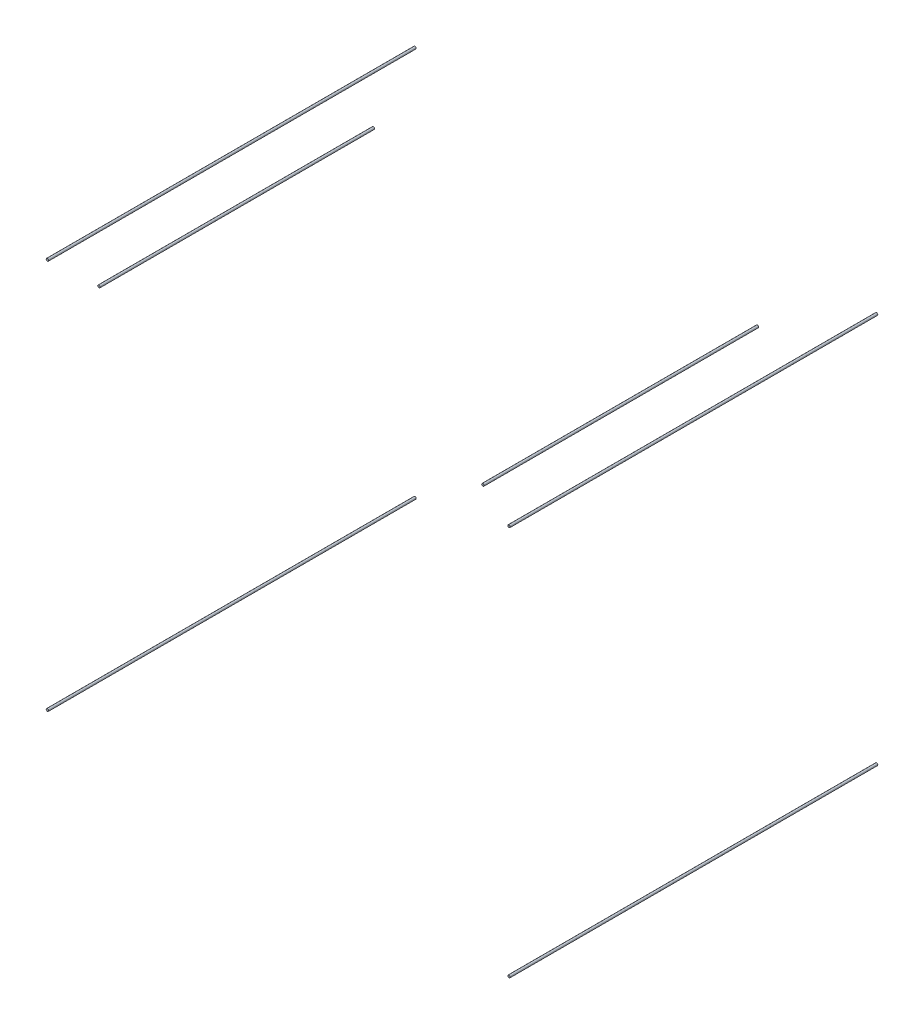
ISO-10303-21;
HEADER;
FILE_DESCRIPTION(('STEP AP214'),'2;1');
FILE_NAME('part.step','',(''),(''),'','','');
FILE_SCHEMA(('AUTOMOTIVE_DESIGN { 1 0 10303 214 1 1 1 1 }'));
ENDSEC;
DATA;
#1=APPLICATION_CONTEXT('core data for automotive mechanical design processes');
#2=APPLICATION_PROTOCOL_DEFINITION('international standard','automotive_design',2000,#1);
#3=PRODUCT_CONTEXT('',#1,'mechanical');
#4=PRODUCT('Part','Part','',(#3));
#5=PRODUCT_RELATED_PRODUCT_CATEGORY('part','',(#4));
#6=PRODUCT_DEFINITION_FORMATION('','',#4);
#7=PRODUCT_DEFINITION_CONTEXT('part definition',#1,'design');
#8=PRODUCT_DEFINITION('design','',#6,#7);
#9=PRODUCT_DEFINITION_SHAPE('','',#8);
#10=(LENGTH_UNIT() NAMED_UNIT(*) SI_UNIT(.MILLI.,.METRE.));
#11=(NAMED_UNIT(*) PLANE_ANGLE_UNIT() SI_UNIT($,.RADIAN.));
#12=(NAMED_UNIT(*) SI_UNIT($,.STERADIAN.) SOLID_ANGLE_UNIT());
#13=UNCERTAINTY_MEASURE_WITH_UNIT(LENGTH_MEASURE(1.E-05),#10,'distance_accuracy_value','');
#14=(GEOMETRIC_REPRESENTATION_CONTEXT(3) GLOBAL_UNCERTAINTY_ASSIGNED_CONTEXT((#13)) GLOBAL_UNIT_ASSIGNED_CONTEXT((#10,
#11,#12)) REPRESENTATION_CONTEXT('',''));
#15=CARTESIAN_POINT('',(0.,0.,0.));
#16=DIRECTION('',(0.,0.,1.));
#17=DIRECTION('',(1.,0.,0.));
#18=AXIS2_PLACEMENT_3D('',#15,#16,#17);
#19=CARTESIAN_POINT('',(56.63,53.77,44.6));
#20=DIRECTION('',(0.,0.,-1.));
#21=DIRECTION('',(-1.,0.,0.));
#22=AXIS2_PLACEMENT_3D('',#19,#20,#21);
#23=CYLINDRICAL_SURFACE('',#22,0.149999999999997);
#24=CARTESIAN_POINT('',(56.63,53.77,44.6));
#25=DIRECTION('',(0.,0.,1.));
#26=DIRECTION('',(1.,0.,0.));
#27=AXIS2_PLACEMENT_3D('',#24,#25,#26);
#28=CIRCLE('',#27,0.149999999999997);
#29=CARTESIAN_POINT('',(56.78,53.77,44.6));
#30=VERTEX_POINT('',#29);
#31=EDGE_CURVE('E50',#30,#30,#28,.T.);
#32=ORIENTED_EDGE('',*,*,#31,.F.);
#33=EDGE_LOOP('',(#32));
#34=FACE_BOUND('',#33,.T.);
#35=CARTESIAN_POINT('',(56.63,53.77,10.1));
#36=DIRECTION('',(0.,0.,1.));
#37=DIRECTION('',(1.,0.,0.));
#38=AXIS2_PLACEMENT_3D('',#35,#36,#37);
#39=CIRCLE('',#38,0.149999999999997);
#40=CARTESIAN_POINT('',(56.78,53.77,10.1));
#41=VERTEX_POINT('',#40);
#42=EDGE_CURVE('E11',#41,#41,#39,.T.);
#43=ORIENTED_EDGE('',*,*,#42,.T.);
#44=EDGE_LOOP('',(#43));
#45=FACE_BOUND('',#44,.T.);
#46=ADVANCED_FACE('F46',(#34,#45),#23,.T.);
#47=CARTESIAN_POINT('',(56.63,53.77,44.6));
#48=DIRECTION('',(0.,0.,1.));
#49=DIRECTION('',(1.,0.,0.));
#50=AXIS2_PLACEMENT_3D('',#47,#48,#49);
#51=PLANE('',#50);
#52=ORIENTED_EDGE('',*,*,#31,.T.);
#53=EDGE_LOOP('',(#52));
#54=FACE_BOUND('',#53,.T.);
#55=ADVANCED_FACE('F48',(#54),#51,.T.);
#56=CARTESIAN_POINT('',(56.63,53.77,10.1));
#57=DIRECTION('',(0.,0.,1.));
#58=DIRECTION('',(1.,0.,0.));
#59=AXIS2_PLACEMENT_3D('',#56,#57,#58);
#60=PLANE('',#59);
#61=ORIENTED_EDGE('',*,*,#42,.F.);
#62=EDGE_LOOP('',(#61));
#63=FACE_BOUND('',#62,.T.);
#64=ADVANCED_FACE('F65',(#63),#60,.F.);
#65=CLOSED_SHELL('',(#46,#55,#64));
#66=MANIFOLD_SOLID_BREP('B2',#65);
#67=CARTESIAN_POINT('',(8.37,51.23,44.6));
#68=DIRECTION('',(0.,0.,-1.));
#69=DIRECTION('',(-1.,0.,0.));
#70=AXIS2_PLACEMENT_3D('',#67,#68,#69);
#71=CYLINDRICAL_SURFACE('',#70,0.150000000000001);
#72=CARTESIAN_POINT('',(8.37,51.23,44.6));
#73=DIRECTION('',(0.,0.,1.));
#74=DIRECTION('',(1.,0.,0.));
#75=AXIS2_PLACEMENT_3D('',#72,#73,#74);
#76=CIRCLE('',#75,0.150000000000001);
#77=CARTESIAN_POINT('',(8.52,51.23,44.6));
#78=VERTEX_POINT('',#77);
#79=EDGE_CURVE('E45',#78,#78,#76,.T.);
#80=ORIENTED_EDGE('',*,*,#79,.F.);
#81=EDGE_LOOP('',(#80));
#82=FACE_BOUND('',#81,.T.);
#83=CARTESIAN_POINT('',(8.37,51.23,10.1));
#84=DIRECTION('',(0.,0.,1.));
#85=DIRECTION('',(1.,0.,0.));
#86=AXIS2_PLACEMENT_3D('',#83,#84,#85);
#87=CIRCLE('',#86,0.150000000000001);
#88=CARTESIAN_POINT('',(8.52,51.23,10.1));
#89=VERTEX_POINT('',#88);
#90=EDGE_CURVE('E98',#89,#89,#87,.T.);
#91=ORIENTED_EDGE('',*,*,#90,.T.);
#92=EDGE_LOOP('',(#91));
#93=FACE_BOUND('',#92,.T.);
#94=ADVANCED_FACE('F95',(#82,#93),#71,.T.);
#95=CARTESIAN_POINT('',(8.37,51.23,44.6));
#96=DIRECTION('',(0.,0.,1.));
#97=DIRECTION('',(1.,0.,0.));
#98=AXIS2_PLACEMENT_3D('',#95,#96,#97);
#99=PLANE('',#98);
#100=ORIENTED_EDGE('',*,*,#79,.T.);
#101=EDGE_LOOP('',(#100));
#102=FACE_BOUND('',#101,.T.);
#103=ADVANCED_FACE('F110',(#102),#99,.T.);
#104=CARTESIAN_POINT('',(8.37,51.23,10.1));
#105=DIRECTION('',(0.,0.,1.));
#106=DIRECTION('',(1.,0.,0.));
#107=AXIS2_PLACEMENT_3D('',#104,#105,#106);
#108=PLANE('',#107);
#109=ORIENTED_EDGE('',*,*,#90,.F.);
#110=EDGE_LOOP('',(#109));
#111=FACE_BOUND('',#110,.T.);
#112=ADVANCED_FACE('F108',(#111),#108,.F.);
#113=CLOSED_SHELL('',(#94,#103,#112));
#114=MANIFOLD_SOLID_BREP('B6',#113);
#115=CARTESIAN_POINT('',(61.5,52.5,46.2));
#116=DIRECTION('',(0.,0.,-1.));
#117=DIRECTION('',(-1.,0.,0.));
#118=AXIS2_PLACEMENT_3D('',#115,#116,#117);
#119=CYLINDRICAL_SURFACE('',#118,0.149999999999997);
#120=CARTESIAN_POINT('',(61.5,52.5,46.2));
#121=DIRECTION('',(0.,0.,1.));
#122=DIRECTION('',(1.,0.,0.));
#123=AXIS2_PLACEMENT_3D('',#120,#121,#122);
#124=CIRCLE('',#123,0.149999999999997);
#125=CARTESIAN_POINT('',(61.65,52.5,46.2));
#126=VERTEX_POINT('',#125);
#127=EDGE_CURVE('E148',#126,#126,#124,.T.);
#128=ORIENTED_EDGE('',*,*,#127,.F.);
#129=EDGE_LOOP('',(#128));
#130=FACE_BOUND('',#129,.T.);
#131=CARTESIAN_POINT('',(61.5,52.5,0.));
#132=DIRECTION('',(0.,0.,1.));
#133=DIRECTION('',(1.,0.,0.));
#134=AXIS2_PLACEMENT_3D('',#131,#132,#133);
#135=CIRCLE('',#134,0.149999999999997);
#136=CARTESIAN_POINT('',(61.65,52.5,0.));
#137=VERTEX_POINT('',#136);
#138=EDGE_CURVE('E94',#137,#137,#135,.T.);
#139=ORIENTED_EDGE('',*,*,#138,.T.);
#140=EDGE_LOOP('',(#139));
#141=FACE_BOUND('',#140,.T.);
#142=ADVANCED_FACE('F144',(#130,#141),#119,.T.);
#143=CARTESIAN_POINT('',(61.5,52.5,46.2));
#144=DIRECTION('',(0.,0.,1.));
#145=DIRECTION('',(1.,0.,0.));
#146=AXIS2_PLACEMENT_3D('',#143,#144,#145);
#147=PLANE('',#146);
#148=ORIENTED_EDGE('',*,*,#127,.T.);
#149=EDGE_LOOP('',(#148));
#150=FACE_BOUND('',#149,.T.);
#151=ADVANCED_FACE('F146',(#150),#147,.T.);
#152=CARTESIAN_POINT('',(61.5,52.5,0.));
#153=DIRECTION('',(0.,0.,1.));
#154=DIRECTION('',(1.,0.,0.));
#155=AXIS2_PLACEMENT_3D('',#152,#153,#154);
#156=PLANE('',#155);
#157=ORIENTED_EDGE('',*,*,#138,.F.);
#158=EDGE_LOOP('',(#157));
#159=FACE_BOUND('',#158,.T.);
#160=ADVANCED_FACE('F163',(#159),#156,.F.);
#161=CLOSED_SHELL('',(#142,#151,#160));
#162=MANIFOLD_SOLID_BREP('B40',#161);
#163=CARTESIAN_POINT('',(3.5,52.5,46.2));
#164=DIRECTION('',(0.,0.,-1.));
#165=DIRECTION('',(-1.,0.,0.));
#166=AXIS2_PLACEMENT_3D('',#163,#164,#165);
#167=CYLINDRICAL_SURFACE('',#166,0.15);
#168=CARTESIAN_POINT('',(3.5,52.5,46.2));
#169=DIRECTION('',(0.,0.,1.));
#170=DIRECTION('',(1.,0.,0.));
#171=AXIS2_PLACEMENT_3D('',#168,#169,#170);
#172=CIRCLE('',#171,0.15);
#173=CARTESIAN_POINT('',(3.65,52.5,46.2));
#174=VERTEX_POINT('',#173);
#175=EDGE_CURVE('E197',#174,#174,#172,.T.);
#176=ORIENTED_EDGE('',*,*,#175,.F.);
#177=EDGE_LOOP('',(#176));
#178=FACE_BOUND('',#177,.T.);
#179=CARTESIAN_POINT('',(3.5,52.5,0.));
#180=DIRECTION('',(0.,0.,1.));
#181=DIRECTION('',(1.,0.,0.));
#182=AXIS2_PLACEMENT_3D('',#179,#180,#181);
#183=CIRCLE('',#182,0.15);
#184=CARTESIAN_POINT('',(3.65,52.5,0.));
#185=VERTEX_POINT('',#184);
#186=EDGE_CURVE('E143',#185,#185,#183,.T.);
#187=ORIENTED_EDGE('',*,*,#186,.T.);
#188=EDGE_LOOP('',(#187));
#189=FACE_BOUND('',#188,.T.);
#190=ADVANCED_FACE('F193',(#178,#189),#167,.T.);
#191=CARTESIAN_POINT('',(3.5,52.5,46.2));
#192=DIRECTION('',(0.,0.,1.));
#193=DIRECTION('',(1.,0.,0.));
#194=AXIS2_PLACEMENT_3D('',#191,#192,#193);
#195=PLANE('',#194);
#196=ORIENTED_EDGE('',*,*,#175,.T.);
#197=EDGE_LOOP('',(#196));
#198=FACE_BOUND('',#197,.T.);
#199=ADVANCED_FACE('F195',(#198),#195,.T.);
#200=CARTESIAN_POINT('',(3.5,52.5,0.));
#201=DIRECTION('',(0.,0.,1.));
#202=DIRECTION('',(1.,0.,0.));
#203=AXIS2_PLACEMENT_3D('',#200,#201,#202);
#204=PLANE('',#203);
#205=ORIENTED_EDGE('',*,*,#186,.F.);
#206=EDGE_LOOP('',(#205));
#207=FACE_BOUND('',#206,.T.);
#208=ADVANCED_FACE('F212',(#207),#204,.F.);
#209=CLOSED_SHELL('',(#190,#199,#208));
#210=MANIFOLD_SOLID_BREP('B89',#209);
#211=CARTESIAN_POINT('',(61.5,3.5,46.2));
#212=DIRECTION('',(0.,0.,-1.));
#213=DIRECTION('',(-1.,0.,0.));
#214=AXIS2_PLACEMENT_3D('',#211,#212,#213);
#215=CYLINDRICAL_SURFACE('',#214,0.149999999999997);
#216=CARTESIAN_POINT('',(61.5,3.5,46.2));
#217=DIRECTION('',(0.,0.,1.));
#218=DIRECTION('',(1.,0.,0.));
#219=AXIS2_PLACEMENT_3D('',#216,#217,#218);
#220=CIRCLE('',#219,0.149999999999997);
#221=CARTESIAN_POINT('',(61.65,3.5,46.2));
#222=VERTEX_POINT('',#221);
#223=EDGE_CURVE('E245',#222,#222,#220,.T.);
#224=ORIENTED_EDGE('',*,*,#223,.F.);
#225=EDGE_LOOP('',(#224));
#226=FACE_BOUND('',#225,.T.);
#227=CARTESIAN_POINT('',(61.5,3.5,0.));
#228=DIRECTION('',(0.,0.,1.));
#229=DIRECTION('',(1.,0.,0.));
#230=AXIS2_PLACEMENT_3D('',#227,#228,#229);
#231=CIRCLE('',#230,0.149999999999997);
#232=CARTESIAN_POINT('',(61.65,3.5,0.));
#233=VERTEX_POINT('',#232);
#234=EDGE_CURVE('E192',#233,#233,#231,.T.);
#235=ORIENTED_EDGE('',*,*,#234,.T.);
#236=EDGE_LOOP('',(#235));
#237=FACE_BOUND('',#236,.T.);
#238=ADVANCED_FACE('F241',(#226,#237),#215,.T.);
#239=CARTESIAN_POINT('',(61.5,3.5,46.2));
#240=DIRECTION('',(0.,0.,1.));
#241=DIRECTION('',(1.,0.,0.));
#242=AXIS2_PLACEMENT_3D('',#239,#240,#241);
#243=PLANE('',#242);
#244=ORIENTED_EDGE('',*,*,#223,.T.);
#245=EDGE_LOOP('',(#244));
#246=FACE_BOUND('',#245,.T.);
#247=ADVANCED_FACE('F243',(#246),#243,.T.);
#248=CARTESIAN_POINT('',(61.5,3.5,0.));
#249=DIRECTION('',(0.,0.,1.));
#250=DIRECTION('',(1.,0.,0.));
#251=AXIS2_PLACEMENT_3D('',#248,#249,#250);
#252=PLANE('',#251);
#253=ORIENTED_EDGE('',*,*,#234,.F.);
#254=EDGE_LOOP('',(#253));
#255=FACE_BOUND('',#254,.T.);
#256=ADVANCED_FACE('F260',(#255),#252,.F.);
#257=CLOSED_SHELL('',(#238,#247,#256));
#258=MANIFOLD_SOLID_BREP('B138',#257);
#259=CARTESIAN_POINT('',(3.5,3.5,46.2));
#260=DIRECTION('',(0.,0.,-1.));
#261=DIRECTION('',(-1.,0.,0.));
#262=AXIS2_PLACEMENT_3D('',#259,#260,#261);
#263=CYLINDRICAL_SURFACE('',#262,0.15);
#264=CARTESIAN_POINT('',(3.5,3.5,46.2));
#265=DIRECTION('',(0.,0.,1.));
#266=DIRECTION('',(1.,0.,0.));
#267=AXIS2_PLACEMENT_3D('',#264,#265,#266);
#268=CIRCLE('',#267,0.15);
#269=CARTESIAN_POINT('',(3.65,3.5,46.2));
#270=VERTEX_POINT('',#269);
#271=EDGE_CURVE('E240',#270,#270,#268,.T.);
#272=ORIENTED_EDGE('',*,*,#271,.F.);
#273=EDGE_LOOP('',(#272));
#274=FACE_BOUND('',#273,.T.);
#275=CARTESIAN_POINT('',(3.5,3.5,0.));
#276=DIRECTION('',(0.,0.,1.));
#277=DIRECTION('',(1.,0.,0.));
#278=AXIS2_PLACEMENT_3D('',#275,#276,#277);
#279=CIRCLE('',#278,0.15);
#280=CARTESIAN_POINT('',(3.65,3.5,0.));
#281=VERTEX_POINT('',#280);
#282=EDGE_CURVE('E285',#281,#281,#279,.T.);
#283=ORIENTED_EDGE('',*,*,#282,.T.);
#284=EDGE_LOOP('',(#283));
#285=FACE_BOUND('',#284,.T.);
#286=ADVANCED_FACE('F282',(#274,#285),#263,.T.);
#287=CARTESIAN_POINT('',(3.5,3.5,46.2));
#288=DIRECTION('',(0.,0.,1.));
#289=DIRECTION('',(1.,0.,0.));
#290=AXIS2_PLACEMENT_3D('',#287,#288,#289);
#291=PLANE('',#290);
#292=ORIENTED_EDGE('',*,*,#271,.T.);
#293=EDGE_LOOP('',(#292));
#294=FACE_BOUND('',#293,.T.);
#295=ADVANCED_FACE('F297',(#294),#291,.T.);
#296=CARTESIAN_POINT('',(3.5,3.5,0.));
#297=DIRECTION('',(0.,0.,1.));
#298=DIRECTION('',(1.,0.,0.));
#299=AXIS2_PLACEMENT_3D('',#296,#297,#298);
#300=PLANE('',#299);
#301=ORIENTED_EDGE('',*,*,#282,.F.);
#302=EDGE_LOOP('',(#301));
#303=FACE_BOUND('',#302,.T.);
#304=ADVANCED_FACE('F295',(#303),#300,.F.);
#305=CLOSED_SHELL('',(#286,#295,#304));
#306=MANIFOLD_SOLID_BREP('B187',#305);
#307=ADVANCED_BREP_SHAPE_REPRESENTATION('',(#18,#66,#114,#162,#210,#258,#306),#14);
#308=SHAPE_DEFINITION_REPRESENTATION(#9,#307);
ENDSEC;
END-ISO-10303-21;
